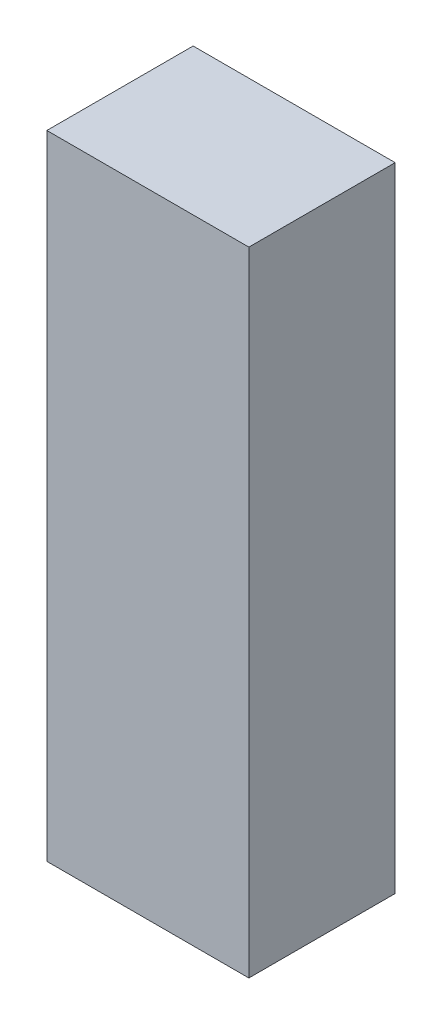
ISO-10303-21;
HEADER;
FILE_DESCRIPTION(('STEP AP214'),'2;1');
FILE_NAME('part.step','',(''),(''),'','','');
FILE_SCHEMA(('AUTOMOTIVE_DESIGN { 1 0 10303 214 1 1 1 1 }'));
ENDSEC;
DATA;
#1=APPLICATION_CONTEXT('core data for automotive mechanical design processes');
#2=APPLICATION_PROTOCOL_DEFINITION('international standard','automotive_design',2000,#1);
#3=PRODUCT_CONTEXT('',#1,'mechanical');
#4=PRODUCT('Part','Part','',(#3));
#5=PRODUCT_RELATED_PRODUCT_CATEGORY('part','',(#4));
#6=PRODUCT_DEFINITION_FORMATION('','',#4);
#7=PRODUCT_DEFINITION_CONTEXT('part definition',#1,'design');
#8=PRODUCT_DEFINITION('design','',#6,#7);
#9=PRODUCT_DEFINITION_SHAPE('','',#8);
#10=(LENGTH_UNIT() NAMED_UNIT(*) SI_UNIT(.MILLI.,.METRE.));
#11=(NAMED_UNIT(*) PLANE_ANGLE_UNIT() SI_UNIT($,.RADIAN.));
#12=(NAMED_UNIT(*) SI_UNIT($,.STERADIAN.) SOLID_ANGLE_UNIT());
#13=UNCERTAINTY_MEASURE_WITH_UNIT(LENGTH_MEASURE(1.E-05),#10,'distance_accuracy_value','');
#14=(GEOMETRIC_REPRESENTATION_CONTEXT(3) GLOBAL_UNCERTAINTY_ASSIGNED_CONTEXT((#13)) GLOBAL_UNIT_ASSIGNED_CONTEXT((#10,
#11,#12)) REPRESENTATION_CONTEXT('',''));
#15=CARTESIAN_POINT('',(0.,0.,0.));
#16=DIRECTION('',(0.,0.,1.));
#17=DIRECTION('',(1.,0.,0.));
#18=AXIS2_PLACEMENT_3D('',#15,#16,#17);
#19=CARTESIAN_POINT('',(17.5387,109.9058,12.7));
#20=DIRECTION('',(-1.,0.,0.));
#21=DIRECTION('',(0.,0.,1.));
#22=AXIS2_PLACEMENT_3D('',#19,#20,#21);
#23=PLANE('',#22);
#24=DIRECTION('',(0.,0.,-1.));
#25=VECTOR('',#24,1.);
#26=CARTESIAN_POINT('',(17.5387,0.,12.7));
#27=LINE('',#26,#25);
#28=CARTESIAN_POINT('',(17.5387,0.,12.7));
#29=VERTEX_POINT('',#28);
#30=CARTESIAN_POINT('',(17.5387,0.,-12.7));
#31=VERTEX_POINT('',#30);
#32=EDGE_CURVE('E109',#29,#31,#27,.T.);
#33=ORIENTED_EDGE('',*,*,#32,.T.);
#34=DIRECTION('',(0.,-1.,0.));
#35=VECTOR('',#34,1.);
#36=CARTESIAN_POINT('',(17.5387,109.9058,-12.7));
#37=LINE('',#36,#35);
#38=CARTESIAN_POINT('',(17.5387,109.9058,-12.7));
#39=VERTEX_POINT('',#38);
#40=EDGE_CURVE('E11',#39,#31,#37,.T.);
#41=ORIENTED_EDGE('',*,*,#40,.F.);
#42=DIRECTION('',(0.,0.,-1.));
#43=VECTOR('',#42,1.);
#44=CARTESIAN_POINT('',(17.5387,109.9058,12.7));
#45=LINE('',#44,#43);
#46=CARTESIAN_POINT('',(17.5387,109.9058,12.7));
#47=VERTEX_POINT('',#46);
#48=EDGE_CURVE('E97',#47,#39,#45,.T.);
#49=ORIENTED_EDGE('',*,*,#48,.F.);
#50=DIRECTION('',(0.,-1.,0.));
#51=VECTOR('',#50,1.);
#52=CARTESIAN_POINT('',(17.5387,109.9058,12.7));
#53=LINE('',#52,#51);
#54=EDGE_CURVE('E105',#47,#29,#53,.T.);
#55=ORIENTED_EDGE('',*,*,#54,.T.);
#56=EDGE_LOOP('',(#33,#41,#49,#55));
#57=FACE_BOUND('',#56,.T.);
#58=ADVANCED_FACE('F46',(#57),#23,.F.);
#59=CARTESIAN_POINT('',(-17.5387,109.9058,-12.7));
#60=DIRECTION('',(0.,0.,1.));
#61=DIRECTION('',(1.,0.,0.));
#62=AXIS2_PLACEMENT_3D('',#59,#60,#61);
#63=PLANE('',#62);
#64=DIRECTION('',(-1.,0.,0.));
#65=VECTOR('',#64,1.);
#66=CARTESIAN_POINT('',(-17.5387,0.,-12.7));
#67=LINE('',#66,#65);
#68=CARTESIAN_POINT('',(-17.5387,0.,-12.7));
#69=VERTEX_POINT('',#68);
#70=EDGE_CURVE('E101',#31,#69,#67,.T.);
#71=ORIENTED_EDGE('',*,*,#70,.T.);
#72=DIRECTION('',(0.,-1.,0.));
#73=VECTOR('',#72,1.);
#74=CARTESIAN_POINT('',(-17.5387,109.9058,-12.7));
#75=LINE('',#74,#73);
#76=CARTESIAN_POINT('',(-17.5387,109.9058,-12.7));
#77=VERTEX_POINT('',#76);
#78=EDGE_CURVE('E54',#77,#69,#75,.T.);
#79=ORIENTED_EDGE('',*,*,#78,.F.);
#80=DIRECTION('',(-1.,0.,0.));
#81=VECTOR('',#80,1.);
#82=CARTESIAN_POINT('',(-17.5387,109.9058,-12.7));
#83=LINE('',#82,#81);
#84=EDGE_CURVE('E92',#39,#77,#83,.T.);
#85=ORIENTED_EDGE('',*,*,#84,.F.);
#86=ORIENTED_EDGE('',*,*,#40,.T.);
#87=EDGE_LOOP('',(#71,#79,#85,#86));
#88=FACE_BOUND('',#87,.T.);
#89=ADVANCED_FACE('F100',(#88),#63,.F.);
#90=CARTESIAN_POINT('',(-17.5387,109.9058,12.7));
#91=DIRECTION('',(1.,0.,0.));
#92=DIRECTION('',(0.,0.,-1.));
#93=AXIS2_PLACEMENT_3D('',#90,#91,#92);
#94=PLANE('',#93);
#95=DIRECTION('',(0.,0.,1.));
#96=VECTOR('',#95,1.);
#97=CARTESIAN_POINT('',(-17.5387,0.,12.7));
#98=LINE('',#97,#96);
#99=CARTESIAN_POINT('',(-17.5387,0.,12.7));
#100=VERTEX_POINT('',#99);
#101=EDGE_CURVE('E79',#69,#100,#98,.T.);
#102=ORIENTED_EDGE('',*,*,#101,.T.);
#103=DIRECTION('',(0.,-1.,0.));
#104=VECTOR('',#103,1.);
#105=CARTESIAN_POINT('',(-17.5387,109.9058,12.7));
#106=LINE('',#105,#104);
#107=CARTESIAN_POINT('',(-17.5387,109.9058,12.7));
#108=VERTEX_POINT('',#107);
#109=EDGE_CURVE('E102',#108,#100,#106,.T.);
#110=ORIENTED_EDGE('',*,*,#109,.F.);
#111=DIRECTION('',(0.,0.,1.));
#112=VECTOR('',#111,1.);
#113=CARTESIAN_POINT('',(-17.5387,109.9058,12.7));
#114=LINE('',#113,#112);
#115=EDGE_CURVE('E95',#77,#108,#114,.T.);
#116=ORIENTED_EDGE('',*,*,#115,.F.);
#117=ORIENTED_EDGE('',*,*,#78,.T.);
#118=EDGE_LOOP('',(#102,#110,#116,#117));
#119=FACE_BOUND('',#118,.T.);
#120=ADVANCED_FACE('F103',(#119),#94,.F.);
#121=CARTESIAN_POINT('',(-17.5387,109.9058,12.7));
#122=DIRECTION('',(0.,0.,-1.));
#123=DIRECTION('',(-1.,0.,0.));
#124=AXIS2_PLACEMENT_3D('',#121,#122,#123);
#125=PLANE('',#124);
#126=DIRECTION('',(1.,0.,0.));
#127=VECTOR('',#126,1.);
#128=CARTESIAN_POINT('',(-17.5387,0.,12.7));
#129=LINE('',#128,#127);
#130=EDGE_CURVE('E85',#100,#29,#129,.T.);
#131=ORIENTED_EDGE('',*,*,#130,.T.);
#132=ORIENTED_EDGE('',*,*,#54,.F.);
#133=DIRECTION('',(1.,0.,0.));
#134=VECTOR('',#133,1.);
#135=CARTESIAN_POINT('',(-17.5387,109.9058,12.7));
#136=LINE('',#135,#134);
#137=EDGE_CURVE('E62',#108,#47,#136,.T.);
#138=ORIENTED_EDGE('',*,*,#137,.F.);
#139=ORIENTED_EDGE('',*,*,#109,.T.);
#140=EDGE_LOOP('',(#131,#132,#138,#139));
#141=FACE_BOUND('',#140,.T.);
#142=ADVANCED_FACE('F116',(#141),#125,.F.);
#143=CARTESIAN_POINT('',(0.,109.9058,0.));
#144=DIRECTION('',(0.,-1.,0.));
#145=DIRECTION('',(0.,0.,-1.));
#146=AXIS2_PLACEMENT_3D('',#143,#144,#145);
#147=PLANE('',#146);
#148=ORIENTED_EDGE('',*,*,#48,.T.);
#149=ORIENTED_EDGE('',*,*,#84,.T.);
#150=ORIENTED_EDGE('',*,*,#115,.T.);
#151=ORIENTED_EDGE('',*,*,#137,.T.);
#152=EDGE_LOOP('',(#148,#149,#150,#151));
#153=FACE_BOUND('',#152,.T.);
#154=ADVANCED_FACE('F93',(#153),#147,.F.);
#155=CARTESIAN_POINT('',(0.,0.,0.));
#156=DIRECTION('',(0.,-1.,0.));
#157=DIRECTION('',(0.,0.,-1.));
#158=AXIS2_PLACEMENT_3D('',#155,#156,#157);
#159=PLANE('',#158);
#160=ORIENTED_EDGE('',*,*,#32,.F.);
#161=ORIENTED_EDGE('',*,*,#130,.F.);
#162=ORIENTED_EDGE('',*,*,#101,.F.);
#163=ORIENTED_EDGE('',*,*,#70,.F.);
#164=EDGE_LOOP('',(#160,#161,#162,#163));
#165=FACE_BOUND('',#164,.T.);
#166=ADVANCED_FACE('F119',(#165),#159,.T.);
#167=CLOSED_SHELL('',(#58,#89,#120,#142,#154,#166));
#168=MANIFOLD_SOLID_BREP('B2',#167);
#169=ADVANCED_BREP_SHAPE_REPRESENTATION('',(#18,#168),#14);
#170=SHAPE_DEFINITION_REPRESENTATION(#9,#169);
ENDSEC;
END-ISO-10303-21;
